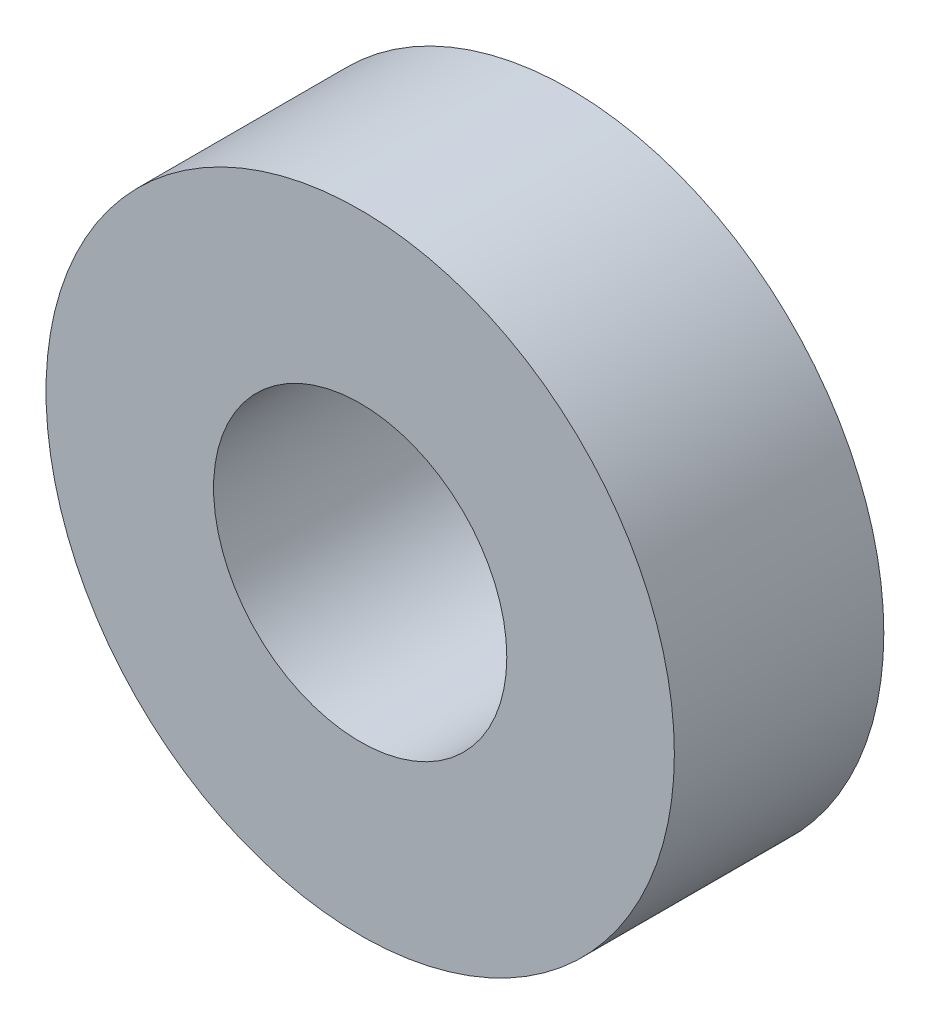
ISO-10303-21;
HEADER;
FILE_DESCRIPTION(('STEP AP214'),'2;1');
FILE_NAME('part.step','',(''),(''),'','','');
FILE_SCHEMA(('AUTOMOTIVE_DESIGN { 1 0 10303 214 1 1 1 1 }'));
ENDSEC;
DATA;
#1=APPLICATION_CONTEXT('core data for automotive mechanical design processes');
#2=APPLICATION_PROTOCOL_DEFINITION('international standard','automotive_design',2000,#1);
#3=PRODUCT_CONTEXT('',#1,'mechanical');
#4=PRODUCT('Part','Part','',(#3));
#5=PRODUCT_RELATED_PRODUCT_CATEGORY('part','',(#4));
#6=PRODUCT_DEFINITION_FORMATION('','',#4);
#7=PRODUCT_DEFINITION_CONTEXT('part definition',#1,'design');
#8=PRODUCT_DEFINITION('design','',#6,#7);
#9=PRODUCT_DEFINITION_SHAPE('','',#8);
#10=(LENGTH_UNIT() NAMED_UNIT(*) SI_UNIT(.MILLI.,.METRE.));
#11=(NAMED_UNIT(*) PLANE_ANGLE_UNIT() SI_UNIT($,.RADIAN.));
#12=(NAMED_UNIT(*) SI_UNIT($,.STERADIAN.) SOLID_ANGLE_UNIT());
#13=UNCERTAINTY_MEASURE_WITH_UNIT(LENGTH_MEASURE(1.E-05),#10,'distance_accuracy_value','');
#14=(GEOMETRIC_REPRESENTATION_CONTEXT(3) GLOBAL_UNCERTAINTY_ASSIGNED_CONTEXT((#13)) GLOBAL_UNIT_ASSIGNED_CONTEXT((#10,
#11,#12)) REPRESENTATION_CONTEXT('',''));
#15=CARTESIAN_POINT('',(0.,0.,0.));
#16=DIRECTION('',(0.,0.,1.));
#17=DIRECTION('',(1.,0.,0.));
#18=AXIS2_PLACEMENT_3D('',#15,#16,#17);
#19=CARTESIAN_POINT('',(0.,0.,16.5));
#20=DIRECTION('',(0.,0.,1.));
#21=DIRECTION('',(1.,0.,0.));
#22=AXIS2_PLACEMENT_3D('',#19,#20,#21);
#23=PLANE('',#22);
#24=CARTESIAN_POINT('',(0.,0.,16.5));
#25=DIRECTION('',(0.,0.,1.));
#26=DIRECTION('',(1.,0.,0.));
#27=AXIS2_PLACEMENT_3D('',#24,#25,#26);
#28=CIRCLE('',#27,34.5);
#29=CARTESIAN_POINT('',(34.5,0.,16.5));
#30=VERTEX_POINT('',#29);
#31=EDGE_CURVE('E10',#30,#30,#28,.T.);
#32=ORIENTED_EDGE('',*,*,#31,.T.);
#33=EDGE_LOOP('',(#32));
#34=FACE_BOUND('',#33,.T.);
#35=CARTESIAN_POINT('',(0.,0.,16.5));
#36=DIRECTION('',(0.,0.,1.));
#37=DIRECTION('',(1.,0.,0.));
#38=AXIS2_PLACEMENT_3D('',#35,#36,#37);
#39=CIRCLE('',#38,16.1);
#40=CARTESIAN_POINT('',(16.1,0.,16.5));
#41=VERTEX_POINT('',#40);
#42=EDGE_CURVE('E43',#41,#41,#39,.T.);
#43=ORIENTED_EDGE('',*,*,#42,.F.);
#44=EDGE_LOOP('',(#43));
#45=FACE_BOUND('',#44,.T.);
#46=ADVANCED_FACE('F32',(#34,#45),#23,.T.);
#47=CARTESIAN_POINT('',(0.,0.,-6.5));
#48=DIRECTION('',(0.,0.,1.));
#49=DIRECTION('',(1.,0.,0.));
#50=AXIS2_PLACEMENT_3D('',#47,#48,#49);
#51=PLANE('',#50);
#52=CARTESIAN_POINT('',(0.,0.,-6.5));
#53=DIRECTION('',(0.,0.,1.));
#54=DIRECTION('',(1.,0.,0.));
#55=AXIS2_PLACEMENT_3D('',#52,#53,#54);
#56=CIRCLE('',#55,34.5);
#57=CARTESIAN_POINT('',(34.5,0.,-6.5));
#58=VERTEX_POINT('',#57);
#59=EDGE_CURVE('E36',#58,#58,#56,.T.);
#60=ORIENTED_EDGE('',*,*,#59,.F.);
#61=EDGE_LOOP('',(#60));
#62=FACE_BOUND('',#61,.T.);
#63=CARTESIAN_POINT('',(0.,0.,-6.5));
#64=DIRECTION('',(0.,0.,1.));
#65=DIRECTION('',(1.,0.,0.));
#66=AXIS2_PLACEMENT_3D('',#63,#64,#65);
#67=CIRCLE('',#66,16.1);
#68=CARTESIAN_POINT('',(16.1,0.,-6.5));
#69=VERTEX_POINT('',#68);
#70=EDGE_CURVE('E45',#69,#69,#67,.T.);
#71=ORIENTED_EDGE('',*,*,#70,.T.);
#72=EDGE_LOOP('',(#71));
#73=FACE_BOUND('',#72,.T.);
#74=ADVANCED_FACE('F55',(#62,#73),#51,.F.);
#75=CARTESIAN_POINT('',(0.,0.,16.5));
#76=DIRECTION('',(0.,0.,-1.));
#77=DIRECTION('',(-1.,0.,0.));
#78=AXIS2_PLACEMENT_3D('',#75,#76,#77);
#79=CYLINDRICAL_SURFACE('',#78,34.5);
#80=ORIENTED_EDGE('',*,*,#31,.F.);
#81=EDGE_LOOP('',(#80));
#82=FACE_BOUND('',#81,.T.);
#83=ORIENTED_EDGE('',*,*,#59,.T.);
#84=EDGE_LOOP('',(#83));
#85=FACE_BOUND('',#84,.T.);
#86=ADVANCED_FACE('F34',(#82,#85),#79,.T.);
#87=CARTESIAN_POINT('',(0.,0.,16.5));
#88=DIRECTION('',(0.,0.,-1.));
#89=DIRECTION('',(-1.,0.,0.));
#90=AXIS2_PLACEMENT_3D('',#87,#88,#89);
#91=CYLINDRICAL_SURFACE('',#90,16.1);
#92=ORIENTED_EDGE('',*,*,#42,.T.);
#93=EDGE_LOOP('',(#92));
#94=FACE_BOUND('',#93,.T.);
#95=ORIENTED_EDGE('',*,*,#70,.F.);
#96=EDGE_LOOP('',(#95));
#97=FACE_BOUND('',#96,.T.);
#98=ADVANCED_FACE('F51',(#94,#97),#91,.F.);
#99=CLOSED_SHELL('',(#46,#74,#86,#98));
#100=MANIFOLD_SOLID_BREP('B2',#99);
#101=ADVANCED_BREP_SHAPE_REPRESENTATION('',(#18,#100),#14);
#102=SHAPE_DEFINITION_REPRESENTATION(#9,#101);
ENDSEC;
END-ISO-10303-21;
